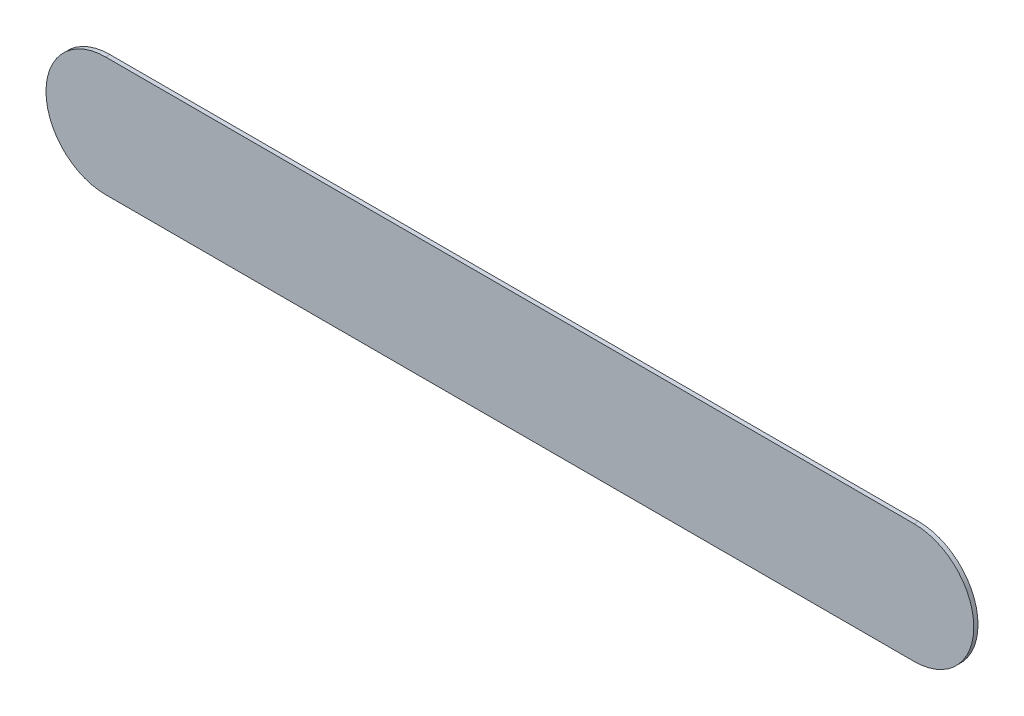
ISO-10303-21;
HEADER;
FILE_DESCRIPTION(('STEP AP214'),'2;1');
FILE_NAME('part.step','',(''),(''),'','','');
FILE_SCHEMA(('AUTOMOTIVE_DESIGN { 1 0 10303 214 1 1 1 1 }'));
ENDSEC;
DATA;
#1=APPLICATION_CONTEXT('core data for automotive mechanical design processes');
#2=APPLICATION_PROTOCOL_DEFINITION('international standard','automotive_design',2000,#1);
#3=PRODUCT_CONTEXT('',#1,'mechanical');
#4=PRODUCT('Part','Part','',(#3));
#5=PRODUCT_RELATED_PRODUCT_CATEGORY('part','',(#4));
#6=PRODUCT_DEFINITION_FORMATION('','',#4);
#7=PRODUCT_DEFINITION_CONTEXT('part definition',#1,'design');
#8=PRODUCT_DEFINITION('design','',#6,#7);
#9=PRODUCT_DEFINITION_SHAPE('','',#8);
#10=(LENGTH_UNIT() NAMED_UNIT(*) SI_UNIT(.MILLI.,.METRE.));
#11=(NAMED_UNIT(*) PLANE_ANGLE_UNIT() SI_UNIT($,.RADIAN.));
#12=(NAMED_UNIT(*) SI_UNIT($,.STERADIAN.) SOLID_ANGLE_UNIT());
#13=UNCERTAINTY_MEASURE_WITH_UNIT(LENGTH_MEASURE(1.E-05),#10,'distance_accuracy_value','');
#14=(GEOMETRIC_REPRESENTATION_CONTEXT(3) GLOBAL_UNCERTAINTY_ASSIGNED_CONTEXT((#13)) GLOBAL_UNIT_ASSIGNED_CONTEXT((#10,
#11,#12)) REPRESENTATION_CONTEXT('',''));
#15=CARTESIAN_POINT('',(0.,0.,0.));
#16=DIRECTION('',(0.,0.,1.));
#17=DIRECTION('',(1.,0.,0.));
#18=AXIS2_PLACEMENT_3D('',#15,#16,#17);
#19=CARTESIAN_POINT('',(38.89998824,121.50000084,0.));
#20=DIRECTION('',(0.,1.,0.));
#21=DIRECTION('',(1.,0.,0.));
#22=AXIS2_PLACEMENT_3D('',#19,#20,#21);
#23=PLANE('',#22);
#24=DIRECTION('',(1.,0.,0.));
#25=VECTOR('',#24,1.);
#26=CARTESIAN_POINT('',(38.89998824,121.50000084,0.03556));
#27=LINE('',#26,#25);
#28=CARTESIAN_POINT('',(38.89998824,121.50000084,0.03556));
#29=VERTEX_POINT('',#28);
#30=CARTESIAN_POINT('',(45.67901456,121.50000084,0.03556));
#31=VERTEX_POINT('',#30);
#32=EDGE_CURVE('E11',#29,#31,#27,.T.);
#33=ORIENTED_EDGE('',*,*,#32,.F.);
#34=DIRECTION('',(0.,0.,1.));
#35=VECTOR('',#34,1.);
#36=CARTESIAN_POINT('',(38.89998824,121.50000084,0.));
#37=LINE('',#36,#35);
#38=CARTESIAN_POINT('',(38.89998824,121.50000084,0.));
#39=VERTEX_POINT('',#38);
#40=EDGE_CURVE('E24',#39,#29,#37,.T.);
#41=ORIENTED_EDGE('',*,*,#40,.F.);
#42=DIRECTION('',(1.,0.,0.));
#43=VECTOR('',#42,1.);
#44=CARTESIAN_POINT('',(38.89998824,121.50000084,0.));
#45=LINE('',#44,#43);
#46=CARTESIAN_POINT('',(45.67901456,121.50000084,0.));
#47=VERTEX_POINT('',#46);
#48=EDGE_CURVE('E75',#39,#47,#45,.T.);
#49=ORIENTED_EDGE('',*,*,#48,.T.);
#50=DIRECTION('',(0.,0.,1.));
#51=VECTOR('',#50,1.);
#52=CARTESIAN_POINT('',(45.67901456,121.50000084,0.));
#53=LINE('',#52,#51);
#54=EDGE_CURVE('E37',#47,#31,#53,.T.);
#55=ORIENTED_EDGE('',*,*,#54,.T.);
#56=EDGE_LOOP('',(#33,#41,#49,#55));
#57=FACE_BOUND('',#56,.T.);
#58=ADVANCED_FACE('F17',(#57),#23,.F.);
#59=CARTESIAN_POINT('',(45.67901456,121.99999984,0.));
#60=DIRECTION('',(0.,0.,-1.));
#61=DIRECTION('',(0.,-1.,0.));
#62=AXIS2_PLACEMENT_3D('',#59,#60,#61);
#63=CYLINDRICAL_SURFACE('',#62,0.499998999999998);
#64=CARTESIAN_POINT('',(45.67901456,121.99999984,0.03556));
#65=DIRECTION('',(0.,0.,1.));
#66=DIRECTION('',(0.,-1.,0.));
#67=AXIS2_PLACEMENT_3D('',#64,#65,#66);
#68=CIRCLE('',#67,0.499998999999998);
#69=CARTESIAN_POINT('',(45.67901456,122.49999884,0.03556));
#70=VERTEX_POINT('',#69);
#71=EDGE_CURVE('E83',#31,#70,#68,.T.);
#72=ORIENTED_EDGE('',*,*,#71,.F.);
#73=ORIENTED_EDGE('',*,*,#54,.F.);
#74=CARTESIAN_POINT('',(45.67901456,121.99999984,0.));
#75=DIRECTION('',(0.,0.,1.));
#76=DIRECTION('',(0.,-1.,0.));
#77=AXIS2_PLACEMENT_3D('',#74,#75,#76);
#78=CIRCLE('',#77,0.499998999999998);
#79=CARTESIAN_POINT('',(45.67901456,122.49999884,0.));
#80=VERTEX_POINT('',#79);
#81=EDGE_CURVE('E81',#47,#80,#78,.T.);
#82=ORIENTED_EDGE('',*,*,#81,.T.);
#83=DIRECTION('',(0.,0.,1.));
#84=VECTOR('',#83,1.);
#85=CARTESIAN_POINT('',(45.67901456,122.49999884,0.));
#86=LINE('',#85,#84);
#87=EDGE_CURVE('E67',#80,#70,#86,.T.);
#88=ORIENTED_EDGE('',*,*,#87,.T.);
#89=EDGE_LOOP('',(#72,#73,#82,#88));
#90=FACE_BOUND('',#89,.T.);
#91=ADVANCED_FACE('F89',(#90),#63,.T.);
#92=CARTESIAN_POINT('',(45.67901456,122.49999884,0.));
#93=DIRECTION('',(0.,-1.,0.));
#94=DIRECTION('',(-1.,0.,0.));
#95=AXIS2_PLACEMENT_3D('',#92,#93,#94);
#96=PLANE('',#95);
#97=DIRECTION('',(-1.,0.,0.));
#98=VECTOR('',#97,1.);
#99=CARTESIAN_POINT('',(45.67901456,122.49999884,0.03556));
#100=LINE('',#99,#98);
#101=CARTESIAN_POINT('',(38.89998824,122.49999884,0.03556));
#102=VERTEX_POINT('',#101);
#103=EDGE_CURVE('E71',#70,#102,#100,.T.);
#104=ORIENTED_EDGE('',*,*,#103,.F.);
#105=ORIENTED_EDGE('',*,*,#87,.F.);
#106=DIRECTION('',(-1.,0.,0.));
#107=VECTOR('',#106,1.);
#108=CARTESIAN_POINT('',(45.67901456,122.49999884,0.));
#109=LINE('',#108,#107);
#110=CARTESIAN_POINT('',(38.89998824,122.49999884,0.));
#111=VERTEX_POINT('',#110);
#112=EDGE_CURVE('E63',#80,#111,#109,.T.);
#113=ORIENTED_EDGE('',*,*,#112,.T.);
#114=DIRECTION('',(0.,0.,1.));
#115=VECTOR('',#114,1.);
#116=CARTESIAN_POINT('',(38.89998824,122.49999884,0.));
#117=LINE('',#116,#115);
#118=EDGE_CURVE('E53',#111,#102,#117,.T.);
#119=ORIENTED_EDGE('',*,*,#118,.T.);
#120=EDGE_LOOP('',(#104,#105,#113,#119));
#121=FACE_BOUND('',#120,.T.);
#122=ADVANCED_FACE('F66',(#121),#96,.F.);
#123=CARTESIAN_POINT('',(38.89998824,121.99999984,0.));
#124=DIRECTION('',(0.,0.,-1.));
#125=DIRECTION('',(0.,1.,0.));
#126=AXIS2_PLACEMENT_3D('',#123,#124,#125);
#127=CYLINDRICAL_SURFACE('',#126,0.499998999999995);
#128=CARTESIAN_POINT('',(38.89998824,121.99999984,0.03556));
#129=DIRECTION('',(0.,0.,1.));
#130=DIRECTION('',(0.,1.,0.));
#131=AXIS2_PLACEMENT_3D('',#128,#129,#130);
#132=CIRCLE('',#131,0.499998999999995);
#133=EDGE_CURVE('E59',#102,#29,#132,.T.);
#134=ORIENTED_EDGE('',*,*,#133,.F.);
#135=ORIENTED_EDGE('',*,*,#118,.F.);
#136=CARTESIAN_POINT('',(38.89998824,121.99999984,0.));
#137=DIRECTION('',(0.,0.,1.));
#138=DIRECTION('',(0.,1.,0.));
#139=AXIS2_PLACEMENT_3D('',#136,#137,#138);
#140=CIRCLE('',#139,0.499998999999995);
#141=EDGE_CURVE('E57',#111,#39,#140,.T.);
#142=ORIENTED_EDGE('',*,*,#141,.T.);
#143=ORIENTED_EDGE('',*,*,#40,.T.);
#144=EDGE_LOOP('',(#134,#135,#142,#143));
#145=FACE_BOUND('',#144,.T.);
#146=ADVANCED_FACE('F55',(#145),#127,.T.);
#147=CARTESIAN_POINT('',(38.89998824,121.50000084,0.));
#148=DIRECTION('',(0.,0.,-1.));
#149=DIRECTION('',(-1.,0.,0.));
#150=AXIS2_PLACEMENT_3D('',#147,#148,#149);
#151=PLANE('',#150);
#152=ORIENTED_EDGE('',*,*,#141,.F.);
#153=ORIENTED_EDGE('',*,*,#112,.F.);
#154=ORIENTED_EDGE('',*,*,#81,.F.);
#155=ORIENTED_EDGE('',*,*,#48,.F.);
#156=EDGE_LOOP('',(#152,#153,#154,#155));
#157=FACE_BOUND('',#156,.T.);
#158=ADVANCED_FACE('F74',(#157),#151,.T.);
#159=CARTESIAN_POINT('',(38.89998824,121.50000084,0.03556));
#160=DIRECTION('',(0.,0.,-1.));
#161=DIRECTION('',(-1.,0.,0.));
#162=AXIS2_PLACEMENT_3D('',#159,#160,#161);
#163=PLANE('',#162);
#164=ORIENTED_EDGE('',*,*,#32,.T.);
#165=ORIENTED_EDGE('',*,*,#71,.T.);
#166=ORIENTED_EDGE('',*,*,#103,.T.);
#167=ORIENTED_EDGE('',*,*,#133,.T.);
#168=EDGE_LOOP('',(#164,#165,#166,#167));
#169=FACE_BOUND('',#168,.T.);
#170=ADVANCED_FACE('F91',(#169),#163,.F.);
#171=CLOSED_SHELL('',(#58,#91,#122,#146,#158,#170));
#172=MANIFOLD_SOLID_BREP('B1',#171);
#173=ADVANCED_BREP_SHAPE_REPRESENTATION('',(#18,#172),#14);
#174=SHAPE_DEFINITION_REPRESENTATION(#9,#173);
ENDSEC;
END-ISO-10303-21;
